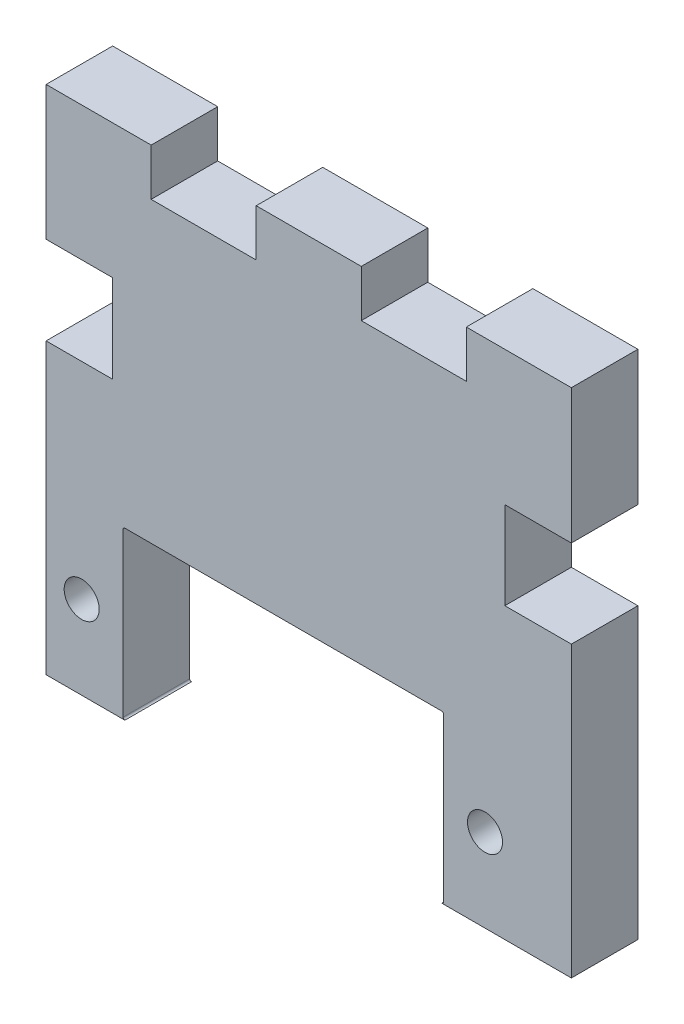
ISO-10303-21;
HEADER;
FILE_DESCRIPTION(('STEP AP214'),'2;1');
FILE_NAME('part.step','',(''),(''),'','','');
FILE_SCHEMA(('AUTOMOTIVE_DESIGN { 1 0 10303 214 1 1 1 1 }'));
ENDSEC;
DATA;
#1=APPLICATION_CONTEXT('core data for automotive mechanical design processes');
#2=APPLICATION_PROTOCOL_DEFINITION('international standard','automotive_design',2000,#1);
#3=PRODUCT_CONTEXT('',#1,'mechanical');
#4=PRODUCT('Part','Part','',(#3));
#5=PRODUCT_RELATED_PRODUCT_CATEGORY('part','',(#4));
#6=PRODUCT_DEFINITION_FORMATION('','',#4);
#7=PRODUCT_DEFINITION_CONTEXT('part definition',#1,'design');
#8=PRODUCT_DEFINITION('design','',#6,#7);
#9=PRODUCT_DEFINITION_SHAPE('','',#8);
#10=(LENGTH_UNIT() NAMED_UNIT(*) SI_UNIT(.MILLI.,.METRE.));
#11=(NAMED_UNIT(*) PLANE_ANGLE_UNIT() SI_UNIT($,.RADIAN.));
#12=(NAMED_UNIT(*) SI_UNIT($,.STERADIAN.) SOLID_ANGLE_UNIT());
#13=UNCERTAINTY_MEASURE_WITH_UNIT(LENGTH_MEASURE(1.E-05),#10,'distance_accuracy_value','');
#14=(GEOMETRIC_REPRESENTATION_CONTEXT(3) GLOBAL_UNCERTAINTY_ASSIGNED_CONTEXT((#13)) GLOBAL_UNIT_ASSIGNED_CONTEXT((#10,
#11,#12)) REPRESENTATION_CONTEXT('',''));
#15=CARTESIAN_POINT('',(0.,0.,0.));
#16=DIRECTION('',(0.,0.,1.));
#17=DIRECTION('',(1.,0.,0.));
#18=AXIS2_PLACEMENT_3D('',#15,#16,#17);
#19=CARTESIAN_POINT('',(38.1,0.,4.826));
#20=DIRECTION('',(-1.,0.,0.));
#21=DIRECTION('',(0.,-1.,0.));
#22=AXIS2_PLACEMENT_3D('',#19,#20,#21);
#23=PLANE('',#22);
#24=DIRECTION('',(0.,1.,0.));
#25=VECTOR('',#24,1.);
#26=CARTESIAN_POINT('',(38.1,0.,4.826));
#27=LINE('',#26,#25);
#28=CARTESIAN_POINT('',(38.1,27.3240988287207,4.826));
#29=VERTEX_POINT('',#28);
#30=CARTESIAN_POINT('',(38.1,37.084,4.826));
#31=VERTEX_POINT('',#30);
#32=EDGE_CURVE('E408',#29,#31,#27,.T.);
#33=ORIENTED_EDGE('',*,*,#32,.F.);
#34=DIRECTION('',(0.,0.,1.));
#35=VECTOR('',#34,1.);
#36=CARTESIAN_POINT('',(38.1,27.3240988287207,0.));
#37=LINE('',#36,#35);
#38=CARTESIAN_POINT('',(38.1,27.3240988287207,0.));
#39=VERTEX_POINT('',#38);
#40=EDGE_CURVE('E250',#39,#29,#37,.T.);
#41=ORIENTED_EDGE('',*,*,#40,.F.);
#42=DIRECTION('',(0.,1.,0.));
#43=VECTOR('',#42,1.);
#44=CARTESIAN_POINT('',(38.1,0.,0.));
#45=LINE('',#44,#43);
#46=CARTESIAN_POINT('',(38.1,37.084,0.));
#47=VERTEX_POINT('',#46);
#48=EDGE_CURVE('E425',#39,#47,#45,.T.);
#49=ORIENTED_EDGE('',*,*,#48,.T.);
#50=DIRECTION('',(0.,0.,-1.));
#51=VECTOR('',#50,1.);
#52=CARTESIAN_POINT('',(38.1,37.084,4.826));
#53=LINE('',#52,#51);
#54=EDGE_CURVE('E435',#31,#47,#53,.T.);
#55=ORIENTED_EDGE('',*,*,#54,.F.);
#56=EDGE_LOOP('',(#33,#41,#49,#55));
#57=FACE_BOUND('',#56,.T.);
#58=ADVANCED_FACE('F33',(#57),#23,.F.);
#59=CARTESIAN_POINT('',(0.,0.,4.826));
#60=DIRECTION('',(1.,0.,0.));
#61=DIRECTION('',(0.,1.,0.));
#62=AXIS2_PLACEMENT_3D('',#59,#60,#61);
#63=PLANE('',#62);
#64=DIRECTION('',(0.,-1.,0.));
#65=VECTOR('',#64,1.);
#66=CARTESIAN_POINT('',(0.,0.,0.));
#67=LINE('',#66,#65);
#68=CARTESIAN_POINT('',(0.,37.084,0.));
#69=VERTEX_POINT('',#68);
#70=CARTESIAN_POINT('',(0.,27.354532370822,0.));
#71=VERTEX_POINT('',#70);
#72=EDGE_CURVE('E418',#69,#71,#67,.T.);
#73=ORIENTED_EDGE('',*,*,#72,.T.);
#74=DIRECTION('',(0.,0.,1.));
#75=VECTOR('',#74,1.);
#76=CARTESIAN_POINT('',(0.,27.354532370822,0.));
#77=LINE('',#76,#75);
#78=CARTESIAN_POINT('',(0.,27.354532370822,4.826));
#79=VERTEX_POINT('',#78);
#80=EDGE_CURVE('E268',#71,#79,#77,.T.);
#81=ORIENTED_EDGE('',*,*,#80,.T.);
#82=DIRECTION('',(0.,-1.,0.));
#83=VECTOR('',#82,1.);
#84=CARTESIAN_POINT('',(0.,0.,4.826));
#85=LINE('',#84,#83);
#86=CARTESIAN_POINT('',(0.,37.084,4.826));
#87=VERTEX_POINT('',#86);
#88=EDGE_CURVE('E400',#87,#79,#85,.T.);
#89=ORIENTED_EDGE('',*,*,#88,.F.);
#90=DIRECTION('',(0.,0.,-1.));
#91=VECTOR('',#90,1.);
#92=CARTESIAN_POINT('',(0.,37.084,4.826));
#93=LINE('',#92,#91);
#94=EDGE_CURVE('E416',#87,#69,#93,.T.);
#95=ORIENTED_EDGE('',*,*,#94,.T.);
#96=EDGE_LOOP('',(#73,#81,#89,#95));
#97=FACE_BOUND('',#96,.T.);
#98=ADVANCED_FACE('F497',(#97),#63,.F.);
#99=CARTESIAN_POINT('',(0.,37.084,4.826));
#100=DIRECTION('',(0.,-1.,0.));
#101=DIRECTION('',(0.,0.,-1.));
#102=AXIS2_PLACEMENT_3D('',#99,#100,#101);
#103=PLANE('',#102);
#104=DIRECTION('',(-1.,0.,0.));
#105=VECTOR('',#104,1.);
#106=CARTESIAN_POINT('',(0.,37.084,4.826));
#107=LINE('',#106,#105);
#108=CARTESIAN_POINT('',(22.86,37.084,4.826));
#109=VERTEX_POINT('',#108);
#110=CARTESIAN_POINT('',(15.24,37.084,4.826));
#111=VERTEX_POINT('',#110);
#112=EDGE_CURVE('E417',#109,#111,#107,.T.);
#113=ORIENTED_EDGE('',*,*,#112,.F.);
#114=DIRECTION('',(0.,0.,1.));
#115=VECTOR('',#114,1.);
#116=CARTESIAN_POINT('',(22.86,37.084,0.));
#117=LINE('',#116,#115);
#118=CARTESIAN_POINT('',(22.86,37.084,0.));
#119=VERTEX_POINT('',#118);
#120=EDGE_CURVE('E294',#119,#109,#117,.T.);
#121=ORIENTED_EDGE('',*,*,#120,.F.);
#122=DIRECTION('',(-1.,0.,0.));
#123=VECTOR('',#122,1.);
#124=CARTESIAN_POINT('',(0.,37.084,0.));
#125=LINE('',#124,#123);
#126=CARTESIAN_POINT('',(15.24,37.084,0.));
#127=VERTEX_POINT('',#126);
#128=EDGE_CURVE('E432',#119,#127,#125,.T.);
#129=ORIENTED_EDGE('',*,*,#128,.T.);
#130=DIRECTION('',(0.,0.,1.));
#131=VECTOR('',#130,1.);
#132=CARTESIAN_POINT('',(15.24,37.084,0.));
#133=LINE('',#132,#131);
#134=EDGE_CURVE('E324',#127,#111,#133,.T.);
#135=ORIENTED_EDGE('',*,*,#134,.T.);
#136=EDGE_LOOP('',(#113,#121,#129,#135));
#137=FACE_BOUND('',#136,.T.);
#138=ADVANCED_FACE('F508',(#137),#103,.F.);
#139=CARTESIAN_POINT('',(7.61999999999999,37.084,4.826));
#140=VERTEX_POINT('',#139);
#141=EDGE_CURVE('E412',#140,#87,#107,.T.);
#142=ORIENTED_EDGE('',*,*,#141,.F.);
#143=DIRECTION('',(0.,0.,1.));
#144=VECTOR('',#143,1.);
#145=CARTESIAN_POINT('',(7.61999999999999,37.084,0.));
#146=LINE('',#145,#144);
#147=CARTESIAN_POINT('',(7.61999999999999,37.084,0.));
#148=VERTEX_POINT('',#147);
#149=EDGE_CURVE('E321',#148,#140,#146,.T.);
#150=ORIENTED_EDGE('',*,*,#149,.F.);
#151=EDGE_CURVE('E428',#148,#69,#125,.T.);
#152=ORIENTED_EDGE('',*,*,#151,.T.);
#153=ORIENTED_EDGE('',*,*,#94,.F.);
#154=EDGE_LOOP('',(#142,#150,#152,#153));
#155=FACE_BOUND('',#154,.T.);
#156=ADVANCED_FACE('F521',(#155),#103,.F.);
#157=CARTESIAN_POINT('',(0.,0.,4.826));
#158=DIRECTION('',(0.,1.,0.));
#159=DIRECTION('',(0.,0.,1.));
#160=AXIS2_PLACEMENT_3D('',#157,#158,#159);
#161=PLANE('',#160);
#162=DIRECTION('',(0.,0.,-1.));
#163=VECTOR('',#162,1.);
#164=CARTESIAN_POINT('',(5.71500000000001,0.,4.826));
#165=LINE('',#164,#163);
#166=CARTESIAN_POINT('',(5.71500000000001,0.,4.826));
#167=VERTEX_POINT('',#166);
#168=CARTESIAN_POINT('',(5.71500000000001,0.,0.));
#169=VERTEX_POINT('',#168);
#170=EDGE_CURVE('E379',#167,#169,#165,.T.);
#171=ORIENTED_EDGE('',*,*,#170,.F.);
#172=DIRECTION('',(1.,0.,0.));
#173=VECTOR('',#172,1.);
#174=CARTESIAN_POINT('',(0.,0.,4.826));
#175=LINE('',#174,#173);
#176=CARTESIAN_POINT('',(0.,0.,4.826));
#177=VERTEX_POINT('',#176);
#178=EDGE_CURVE('E405',#177,#167,#175,.T.);
#179=ORIENTED_EDGE('',*,*,#178,.F.);
#180=DIRECTION('',(0.,0.,-1.));
#181=VECTOR('',#180,1.);
#182=CARTESIAN_POINT('',(0.,0.,4.826));
#183=LINE('',#182,#181);
#184=CARTESIAN_POINT('',(0.,0.,0.));
#185=VERTEX_POINT('',#184);
#186=EDGE_CURVE('E11',#177,#185,#183,.T.);
#187=ORIENTED_EDGE('',*,*,#186,.T.);
#188=DIRECTION('',(1.,0.,0.));
#189=VECTOR('',#188,1.);
#190=CARTESIAN_POINT('',(0.,0.,0.));
#191=LINE('',#190,#189);
#192=EDGE_CURVE('E422',#185,#169,#191,.T.);
#193=ORIENTED_EDGE('',*,*,#192,.T.);
#194=EDGE_LOOP('',(#171,#179,#187,#193));
#195=FACE_BOUND('',#194,.T.);
#196=ADVANCED_FACE('F480',(#195),#161,.F.);
#197=CARTESIAN_POINT('',(0.,20.9740988287207,4.826));
#198=VERTEX_POINT('',#197);
#199=EDGE_CURVE('E404',#198,#177,#85,.T.);
#200=ORIENTED_EDGE('',*,*,#199,.F.);
#201=DIRECTION('',(0.,0.,1.));
#202=VECTOR('',#201,1.);
#203=CARTESIAN_POINT('',(0.,20.9740988287207,0.));
#204=LINE('',#203,#202);
#205=CARTESIAN_POINT('',(0.,20.9740988287207,0.));
#206=VERTEX_POINT('',#205);
#207=EDGE_CURVE('E261',#206,#198,#204,.T.);
#208=ORIENTED_EDGE('',*,*,#207,.F.);
#209=EDGE_CURVE('E397',#206,#185,#67,.T.);
#210=ORIENTED_EDGE('',*,*,#209,.T.);
#211=ORIENTED_EDGE('',*,*,#186,.F.);
#212=EDGE_LOOP('',(#200,#208,#210,#211));
#213=FACE_BOUND('',#212,.T.);
#214=ADVANCED_FACE('F35',(#213),#63,.F.);
#215=CARTESIAN_POINT('',(28.702,0.,4.826));
#216=VERTEX_POINT('',#215);
#217=CARTESIAN_POINT('',(38.1,0.,4.826));
#218=VERTEX_POINT('',#217);
#219=EDGE_CURVE('E403',#216,#218,#175,.T.);
#220=ORIENTED_EDGE('',*,*,#219,.F.);
#221=DIRECTION('',(0.,0.,-1.));
#222=VECTOR('',#221,1.);
#223=CARTESIAN_POINT('',(28.702,0.,4.826));
#224=LINE('',#223,#222);
#225=CARTESIAN_POINT('',(28.702,0.,0.));
#226=VERTEX_POINT('',#225);
#227=EDGE_CURVE('E381',#216,#226,#224,.T.);
#228=ORIENTED_EDGE('',*,*,#227,.T.);
#229=CARTESIAN_POINT('',(38.1,0.,0.));
#230=VERTEX_POINT('',#229);
#231=EDGE_CURVE('E421',#226,#230,#191,.T.);
#232=ORIENTED_EDGE('',*,*,#231,.T.);
#233=DIRECTION('',(0.,0.,-1.));
#234=VECTOR('',#233,1.);
#235=CARTESIAN_POINT('',(38.1,0.,4.826));
#236=LINE('',#235,#234);
#237=EDGE_CURVE('E41',#218,#230,#236,.T.);
#238=ORIENTED_EDGE('',*,*,#237,.F.);
#239=EDGE_LOOP('',(#220,#228,#232,#238));
#240=FACE_BOUND('',#239,.T.);
#241=ADVANCED_FACE('F447',(#240),#161,.F.);
#242=CARTESIAN_POINT('',(38.1,20.9740988287207,0.));
#243=VERTEX_POINT('',#242);
#244=EDGE_CURVE('E426',#230,#243,#45,.T.);
#245=ORIENTED_EDGE('',*,*,#244,.T.);
#246=DIRECTION('',(0.,0.,1.));
#247=VECTOR('',#246,1.);
#248=CARTESIAN_POINT('',(38.1,20.9740988287207,0.));
#249=LINE('',#248,#247);
#250=CARTESIAN_POINT('',(38.1,20.9740988287207,4.826));
#251=VERTEX_POINT('',#250);
#252=EDGE_CURVE('E48',#243,#251,#249,.T.);
#253=ORIENTED_EDGE('',*,*,#252,.T.);
#254=EDGE_CURVE('E409',#218,#251,#27,.T.);
#255=ORIENTED_EDGE('',*,*,#254,.F.);
#256=ORIENTED_EDGE('',*,*,#237,.T.);
#257=EDGE_LOOP('',(#245,#253,#255,#256));
#258=FACE_BOUND('',#257,.T.);
#259=ADVANCED_FACE('F441',(#258),#23,.F.);
#260=CARTESIAN_POINT('',(30.48,37.084,0.));
#261=VERTEX_POINT('',#260);
#262=EDGE_CURVE('E429',#47,#261,#125,.T.);
#263=ORIENTED_EDGE('',*,*,#262,.T.);
#264=DIRECTION('',(0.,0.,1.));
#265=VECTOR('',#264,1.);
#266=CARTESIAN_POINT('',(30.48,37.084,0.));
#267=LINE('',#266,#265);
#268=CARTESIAN_POINT('',(30.48,37.084,4.826));
#269=VERTEX_POINT('',#268);
#270=EDGE_CURVE('E297',#261,#269,#267,.T.);
#271=ORIENTED_EDGE('',*,*,#270,.T.);
#272=EDGE_CURVE('E413',#31,#269,#107,.T.);
#273=ORIENTED_EDGE('',*,*,#272,.F.);
#274=ORIENTED_EDGE('',*,*,#54,.T.);
#275=EDGE_LOOP('',(#263,#271,#273,#274));
#276=FACE_BOUND('',#275,.T.);
#277=ADVANCED_FACE('F524',(#276),#103,.F.);
#278=CARTESIAN_POINT('',(0.,0.,4.826));
#279=DIRECTION('',(0.,0.,-1.));
#280=DIRECTION('',(-1.,0.,0.));
#281=AXIS2_PLACEMENT_3D('',#278,#279,#280);
#282=PLANE('',#281);
#283=DIRECTION('',(0.,-1.,0.));
#284=VECTOR('',#283,1.);
#285=CARTESIAN_POINT('',(33.274,27.3240988287207,4.826));
#286=LINE('',#285,#284);
#287=CARTESIAN_POINT('',(33.274,27.3240988287207,4.826));
#288=VERTEX_POINT('',#287);
#289=CARTESIAN_POINT('',(33.274,20.9740988287207,4.826));
#290=VERTEX_POINT('',#289);
#291=EDGE_CURVE('E225',#288,#290,#286,.T.);
#292=ORIENTED_EDGE('',*,*,#291,.F.);
#293=DIRECTION('',(-1.,0.,0.));
#294=VECTOR('',#293,1.);
#295=CARTESIAN_POINT('',(33.274,27.3240988287207,4.826));
#296=LINE('',#295,#294);
#297=EDGE_CURVE('E238',#29,#288,#296,.T.);
#298=ORIENTED_EDGE('',*,*,#297,.F.);
#299=ORIENTED_EDGE('',*,*,#32,.T.);
#300=ORIENTED_EDGE('',*,*,#272,.T.);
#301=DIRECTION('',(0.,1.,0.));
#302=VECTOR('',#301,1.);
#303=CARTESIAN_POINT('',(30.48,37.084,4.826));
#304=LINE('',#303,#302);
#305=CARTESIAN_POINT('',(30.48,33.6740988287207,4.826));
#306=VERTEX_POINT('',#305);
#307=EDGE_CURVE('E281',#306,#269,#304,.T.);
#308=ORIENTED_EDGE('',*,*,#307,.F.);
#309=DIRECTION('',(1.,0.,0.));
#310=VECTOR('',#309,1.);
#311=CARTESIAN_POINT('',(22.86,33.6740988287207,4.826));
#312=LINE('',#311,#310);
#313=CARTESIAN_POINT('',(22.86,33.6740988287207,4.826));
#314=VERTEX_POINT('',#313);
#315=EDGE_CURVE('E290',#314,#306,#312,.T.);
#316=ORIENTED_EDGE('',*,*,#315,.F.);
#317=DIRECTION('',(0.,-1.,0.));
#318=VECTOR('',#317,1.);
#319=CARTESIAN_POINT('',(22.86,37.084,4.826));
#320=LINE('',#319,#318);
#321=EDGE_CURVE('E271',#109,#314,#320,.T.);
#322=ORIENTED_EDGE('',*,*,#321,.F.);
#323=ORIENTED_EDGE('',*,*,#112,.T.);
#324=DIRECTION('',(0.,1.,0.));
#325=VECTOR('',#324,1.);
#326=CARTESIAN_POINT('',(15.24,37.084,4.826));
#327=LINE('',#326,#325);
#328=CARTESIAN_POINT('',(15.24,33.6740988287207,4.826));
#329=VERTEX_POINT('',#328);
#330=EDGE_CURVE('E307',#329,#111,#327,.T.);
#331=ORIENTED_EDGE('',*,*,#330,.F.);
#332=DIRECTION('',(1.,0.,0.));
#333=VECTOR('',#332,1.);
#334=CARTESIAN_POINT('',(7.61999999999999,33.6740988287207,4.826));
#335=LINE('',#334,#333);
#336=CARTESIAN_POINT('',(7.61999999999999,33.6740988287207,4.826));
#337=VERTEX_POINT('',#336);
#338=EDGE_CURVE('E316',#337,#329,#335,.T.);
#339=ORIENTED_EDGE('',*,*,#338,.F.);
#340=DIRECTION('',(0.,-1.,0.));
#341=VECTOR('',#340,1.);
#342=CARTESIAN_POINT('',(7.61999999999999,37.084,4.826));
#343=LINE('',#342,#341);
#344=EDGE_CURVE('E296',#140,#337,#343,.T.);
#345=ORIENTED_EDGE('',*,*,#344,.F.);
#346=ORIENTED_EDGE('',*,*,#141,.T.);
#347=ORIENTED_EDGE('',*,*,#88,.T.);
#348=DIRECTION('',(-1.,0.,0.));
#349=VECTOR('',#348,1.);
#350=CARTESIAN_POINT('',(0.,27.354532370822,4.826));
#351=LINE('',#350,#349);
#352=CARTESIAN_POINT('',(4.826,27.354532370822,4.826));
#353=VERTEX_POINT('',#352);
#354=EDGE_CURVE('E256',#353,#79,#351,.T.);
#355=ORIENTED_EDGE('',*,*,#354,.F.);
#356=DIRECTION('',(0.,1.,0.));
#357=VECTOR('',#356,1.);
#358=CARTESIAN_POINT('',(4.826,27.354532370822,4.826));
#359=LINE('',#358,#357);
#360=CARTESIAN_POINT('',(4.826,20.9740988287207,4.826));
#361=VERTEX_POINT('',#360);
#362=EDGE_CURVE('E264',#361,#353,#359,.T.);
#363=ORIENTED_EDGE('',*,*,#362,.F.);
#364=DIRECTION('',(1.,0.,0.));
#365=VECTOR('',#364,1.);
#366=CARTESIAN_POINT('',(0.,20.9740988287207,4.826));
#367=LINE('',#366,#365);
#368=EDGE_CURVE('E249',#198,#361,#367,.T.);
#369=ORIENTED_EDGE('',*,*,#368,.F.);
#370=ORIENTED_EDGE('',*,*,#199,.T.);
#371=ORIENTED_EDGE('',*,*,#178,.T.);
#372=CARTESIAN_POINT('',(5.71500000000001,0.126999999999999,4.826));
#373=DIRECTION('',(0.,0.,-1.));
#374=DIRECTION('',(-1.,0.,0.));
#375=AXIS2_PLACEMENT_3D('',#372,#373,#374);
#376=CIRCLE('',#375,0.127);
#377=CARTESIAN_POINT('',(5.58800000000001,0.126999999999999,4.826));
#378=VERTEX_POINT('',#377);
#379=EDGE_CURVE('E340',#167,#378,#376,.T.);
#380=ORIENTED_EDGE('',*,*,#379,.T.);
#381=DIRECTION('',(0.,1.,0.));
#382=VECTOR('',#381,1.);
#383=CARTESIAN_POINT('',(5.58800000000001,11.938,4.826));
#384=LINE('',#383,#382);
#385=CARTESIAN_POINT('',(5.58800000000001,11.938,4.826));
#386=VERTEX_POINT('',#385);
#387=EDGE_CURVE('E343',#378,#386,#384,.T.);
#388=ORIENTED_EDGE('',*,*,#387,.T.);
#389=CARTESIAN_POINT('',(5.71500000000001,11.938,4.826));
#390=DIRECTION('',(0.,0.,-1.));
#391=DIRECTION('',(-1.,0.,0.));
#392=AXIS2_PLACEMENT_3D('',#389,#390,#391);
#393=CIRCLE('',#392,0.127);
#394=CARTESIAN_POINT('',(5.71500000000001,12.065,4.826));
#395=VERTEX_POINT('',#394);
#396=EDGE_CURVE('E346',#386,#395,#393,.T.);
#397=ORIENTED_EDGE('',*,*,#396,.T.);
#398=DIRECTION('',(1.,0.,0.));
#399=VECTOR('',#398,1.);
#400=CARTESIAN_POINT('',(28.702,12.065,4.826));
#401=LINE('',#400,#399);
#402=CARTESIAN_POINT('',(28.702,12.065,4.826));
#403=VERTEX_POINT('',#402);
#404=EDGE_CURVE('E349',#395,#403,#401,.T.);
#405=ORIENTED_EDGE('',*,*,#404,.T.);
#406=CARTESIAN_POINT('',(28.702,11.938,4.826));
#407=DIRECTION('',(0.,0.,-1.));
#408=DIRECTION('',(-1.,0.,0.));
#409=AXIS2_PLACEMENT_3D('',#406,#407,#408);
#410=CIRCLE('',#409,0.127);
#411=CARTESIAN_POINT('',(28.829,11.938,4.826));
#412=VERTEX_POINT('',#411);
#413=EDGE_CURVE('E330',#403,#412,#410,.T.);
#414=ORIENTED_EDGE('',*,*,#413,.T.);
#415=DIRECTION('',(0.,-1.,0.));
#416=VECTOR('',#415,1.);
#417=CARTESIAN_POINT('',(28.829,0.126999999999995,4.826));
#418=LINE('',#417,#416);
#419=CARTESIAN_POINT('',(28.829,0.126999999999995,4.826));
#420=VERTEX_POINT('',#419);
#421=EDGE_CURVE('E333',#412,#420,#418,.T.);
#422=ORIENTED_EDGE('',*,*,#421,.T.);
#423=CARTESIAN_POINT('',(28.702,0.126999999999995,4.826));
#424=DIRECTION('',(0.,0.,-1.));
#425=DIRECTION('',(-1.,0.,0.));
#426=AXIS2_PLACEMENT_3D('',#423,#424,#425);
#427=CIRCLE('',#426,0.127);
#428=EDGE_CURVE('E337',#420,#216,#427,.T.);
#429=ORIENTED_EDGE('',*,*,#428,.T.);
#430=ORIENTED_EDGE('',*,*,#219,.T.);
#431=ORIENTED_EDGE('',*,*,#254,.T.);
#432=DIRECTION('',(1.,0.,0.));
#433=VECTOR('',#432,1.);
#434=CARTESIAN_POINT('',(33.274,20.9740988287207,4.826));
#435=LINE('',#434,#433);
#436=EDGE_CURVE('E241',#290,#251,#435,.T.);
#437=ORIENTED_EDGE('',*,*,#436,.F.);
#438=EDGE_LOOP('',(#292,#298,#299,#300,#308,#316,#322,#323,#331,#339,#345,#346,#347,#355,#363,
#369,#370,#371,#380,#388,#397,#405,#414,#422,#429,#430,#431,#437));
#439=FACE_BOUND('',#438,.T.);
#440=CARTESIAN_POINT('',(31.8365194618769,6.03249999999999,4.826));
#441=DIRECTION('',(0.,0.,1.));
#442=DIRECTION('',(1.,0.,0.));
#443=AXIS2_PLACEMENT_3D('',#440,#441,#442);
#444=CIRCLE('',#443,1.27);
#445=CARTESIAN_POINT('',(33.1065194618769,6.03249999999999,4.826));
#446=VERTEX_POINT('',#445);
#447=EDGE_CURVE('E372',#446,#446,#444,.T.);
#448=ORIENTED_EDGE('',*,*,#447,.F.);
#449=EDGE_LOOP('',(#448));
#450=FACE_BOUND('',#449,.T.);
#451=CARTESIAN_POINT('',(2.58048053812314,6.0325,4.826));
#452=DIRECTION('',(0.,0.,1.));
#453=DIRECTION('',(1.,0.,0.));
#454=AXIS2_PLACEMENT_3D('',#451,#452,#453);
#455=CIRCLE('',#454,1.27);
#456=CARTESIAN_POINT('',(3.85048053812314,6.0325,4.826));
#457=VERTEX_POINT('',#456);
#458=EDGE_CURVE('E391',#457,#457,#455,.T.);
#459=ORIENTED_EDGE('',*,*,#458,.F.);
#460=EDGE_LOOP('',(#459));
#461=FACE_BOUND('',#460,.T.);
#462=ADVANCED_FACE('F452',(#439,#450,#461),#282,.F.);
#463=CARTESIAN_POINT('',(0.,0.,0.));
#464=DIRECTION('',(0.,0.,-1.));
#465=DIRECTION('',(-1.,0.,0.));
#466=AXIS2_PLACEMENT_3D('',#463,#464,#465);
#467=PLANE('',#466);
#468=DIRECTION('',(-1.,0.,0.));
#469=VECTOR('',#468,1.);
#470=CARTESIAN_POINT('',(33.274,27.3240988287207,0.));
#471=LINE('',#470,#469);
#472=CARTESIAN_POINT('',(33.274,27.3240988287207,0.));
#473=VERTEX_POINT('',#472);
#474=EDGE_CURVE('E227',#39,#473,#471,.T.);
#475=ORIENTED_EDGE('',*,*,#474,.T.);
#476=DIRECTION('',(0.,-1.,0.));
#477=VECTOR('',#476,1.);
#478=CARTESIAN_POINT('',(33.274,27.3240988287207,0.));
#479=LINE('',#478,#477);
#480=CARTESIAN_POINT('',(33.274,20.9740988287207,0.));
#481=VERTEX_POINT('',#480);
#482=EDGE_CURVE('E222',#473,#481,#479,.T.);
#483=ORIENTED_EDGE('',*,*,#482,.T.);
#484=DIRECTION('',(1.,0.,0.));
#485=VECTOR('',#484,1.);
#486=CARTESIAN_POINT('',(33.274,20.9740988287207,0.));
#487=LINE('',#486,#485);
#488=EDGE_CURVE('E229',#481,#243,#487,.T.);
#489=ORIENTED_EDGE('',*,*,#488,.T.);
#490=ORIENTED_EDGE('',*,*,#244,.F.);
#491=ORIENTED_EDGE('',*,*,#231,.F.);
#492=CARTESIAN_POINT('',(28.702,0.126999999999995,0.));
#493=DIRECTION('',(0.,0.,-1.));
#494=DIRECTION('',(-1.,0.,0.));
#495=AXIS2_PLACEMENT_3D('',#492,#493,#494);
#496=CIRCLE('',#495,0.127);
#497=CARTESIAN_POINT('',(28.829,0.126999999999995,0.));
#498=VERTEX_POINT('',#497);
#499=EDGE_CURVE('E357',#498,#226,#496,.T.);
#500=ORIENTED_EDGE('',*,*,#499,.F.);
#501=DIRECTION('',(0.,-1.,0.));
#502=VECTOR('',#501,1.);
#503=CARTESIAN_POINT('',(28.829,0.126999999999995,0.));
#504=LINE('',#503,#502);
#505=CARTESIAN_POINT('',(28.829,11.938,0.));
#506=VERTEX_POINT('',#505);
#507=EDGE_CURVE('E354',#506,#498,#504,.T.);
#508=ORIENTED_EDGE('',*,*,#507,.F.);
#509=CARTESIAN_POINT('',(28.702,11.938,0.));
#510=DIRECTION('',(0.,0.,-1.));
#511=DIRECTION('',(-1.,0.,0.));
#512=AXIS2_PLACEMENT_3D('',#509,#510,#511);
#513=CIRCLE('',#512,0.127);
#514=CARTESIAN_POINT('',(28.702,12.065,0.));
#515=VERTEX_POINT('',#514);
#516=EDGE_CURVE('E323',#515,#506,#513,.T.);
#517=ORIENTED_EDGE('',*,*,#516,.F.);
#518=DIRECTION('',(1.,0.,0.));
#519=VECTOR('',#518,1.);
#520=CARTESIAN_POINT('',(28.702,12.065,0.));
#521=LINE('',#520,#519);
#522=CARTESIAN_POINT('',(5.71500000000001,12.065,0.));
#523=VERTEX_POINT('',#522);
#524=EDGE_CURVE('E334',#523,#515,#521,.T.);
#525=ORIENTED_EDGE('',*,*,#524,.F.);
#526=CARTESIAN_POINT('',(5.71500000000001,11.938,0.));
#527=DIRECTION('',(0.,0.,-1.));
#528=DIRECTION('',(-1.,0.,0.));
#529=AXIS2_PLACEMENT_3D('',#526,#527,#528);
#530=CIRCLE('',#529,0.127);
#531=CARTESIAN_POINT('',(5.58800000000001,11.938,0.));
#532=VERTEX_POINT('',#531);
#533=EDGE_CURVE('E365',#532,#523,#530,.T.);
#534=ORIENTED_EDGE('',*,*,#533,.F.);
#535=DIRECTION('',(0.,1.,0.));
#536=VECTOR('',#535,1.);
#537=CARTESIAN_POINT('',(5.58800000000001,11.938,0.));
#538=LINE('',#537,#536);
#539=CARTESIAN_POINT('',(5.58800000000001,0.126999999999999,0.));
#540=VERTEX_POINT('',#539);
#541=EDGE_CURVE('E362',#540,#532,#538,.T.);
#542=ORIENTED_EDGE('',*,*,#541,.F.);
#543=CARTESIAN_POINT('',(5.71500000000001,0.126999999999999,0.));
#544=DIRECTION('',(0.,0.,-1.));
#545=DIRECTION('',(-1.,0.,0.));
#546=AXIS2_PLACEMENT_3D('',#543,#544,#545);
#547=CIRCLE('',#546,0.127);
#548=EDGE_CURVE('E359',#169,#540,#547,.T.);
#549=ORIENTED_EDGE('',*,*,#548,.F.);
#550=ORIENTED_EDGE('',*,*,#192,.F.);
#551=ORIENTED_EDGE('',*,*,#209,.F.);
#552=DIRECTION('',(1.,0.,0.));
#553=VECTOR('',#552,1.);
#554=CARTESIAN_POINT('',(0.,20.9740988287207,0.));
#555=LINE('',#554,#553);
#556=CARTESIAN_POINT('',(4.826,20.9740988287207,0.));
#557=VERTEX_POINT('',#556);
#558=EDGE_CURVE('E253',#206,#557,#555,.T.);
#559=ORIENTED_EDGE('',*,*,#558,.T.);
#560=DIRECTION('',(0.,1.,0.));
#561=VECTOR('',#560,1.);
#562=CARTESIAN_POINT('',(4.826,27.354532370822,0.));
#563=LINE('',#562,#561);
#564=CARTESIAN_POINT('',(4.826,27.354532370822,0.));
#565=VERTEX_POINT('',#564);
#566=EDGE_CURVE('E56',#557,#565,#563,.T.);
#567=ORIENTED_EDGE('',*,*,#566,.T.);
#568=DIRECTION('',(-1.,0.,0.));
#569=VECTOR('',#568,1.);
#570=CARTESIAN_POINT('',(0.,27.354532370822,0.));
#571=LINE('',#570,#569);
#572=EDGE_CURVE('E258',#565,#71,#571,.T.);
#573=ORIENTED_EDGE('',*,*,#572,.T.);
#574=ORIENTED_EDGE('',*,*,#72,.F.);
#575=ORIENTED_EDGE('',*,*,#151,.F.);
#576=DIRECTION('',(0.,-1.,0.));
#577=VECTOR('',#576,1.);
#578=CARTESIAN_POINT('',(7.61999999999999,37.084,0.));
#579=LINE('',#578,#577);
#580=CARTESIAN_POINT('',(7.61999999999999,33.6740988287207,0.));
#581=VERTEX_POINT('',#580);
#582=EDGE_CURVE('E303',#148,#581,#579,.T.);
#583=ORIENTED_EDGE('',*,*,#582,.T.);
#584=DIRECTION('',(1.,0.,0.));
#585=VECTOR('',#584,1.);
#586=CARTESIAN_POINT('',(7.61999999999999,33.6740988287207,0.));
#587=LINE('',#586,#585);
#588=CARTESIAN_POINT('',(15.24,33.6740988287207,0.));
#589=VERTEX_POINT('',#588);
#590=EDGE_CURVE('E306',#581,#589,#587,.T.);
#591=ORIENTED_EDGE('',*,*,#590,.T.);
#592=DIRECTION('',(0.,1.,0.));
#593=VECTOR('',#592,1.);
#594=CARTESIAN_POINT('',(15.24,37.084,0.));
#595=LINE('',#594,#593);
#596=EDGE_CURVE('E310',#589,#127,#595,.T.);
#597=ORIENTED_EDGE('',*,*,#596,.T.);
#598=ORIENTED_EDGE('',*,*,#128,.F.);
#599=DIRECTION('',(0.,-1.,0.));
#600=VECTOR('',#599,1.);
#601=CARTESIAN_POINT('',(22.86,37.084,0.));
#602=LINE('',#601,#600);
#603=CARTESIAN_POINT('',(22.86,33.6740988287207,0.));
#604=VERTEX_POINT('',#603);
#605=EDGE_CURVE('E277',#119,#604,#602,.T.);
#606=ORIENTED_EDGE('',*,*,#605,.T.);
#607=DIRECTION('',(1.,0.,0.));
#608=VECTOR('',#607,1.);
#609=CARTESIAN_POINT('',(22.86,33.6740988287207,0.));
#610=LINE('',#609,#608);
#611=CARTESIAN_POINT('',(30.48,33.6740988287207,0.));
#612=VERTEX_POINT('',#611);
#613=EDGE_CURVE('E280',#604,#612,#610,.T.);
#614=ORIENTED_EDGE('',*,*,#613,.T.);
#615=DIRECTION('',(0.,1.,0.));
#616=VECTOR('',#615,1.);
#617=CARTESIAN_POINT('',(30.48,37.084,0.));
#618=LINE('',#617,#616);
#619=EDGE_CURVE('E284',#612,#261,#618,.T.);
#620=ORIENTED_EDGE('',*,*,#619,.T.);
#621=ORIENTED_EDGE('',*,*,#262,.F.);
#622=ORIENTED_EDGE('',*,*,#48,.F.);
#623=EDGE_LOOP('',(#475,#483,#489,#490,#491,#500,#508,#517,#525,#534,#542,#549,#550,#551,#559,
#567,#573,#574,#575,#583,#591,#597,#598,#606,#614,#620,#621,#622));
#624=FACE_BOUND('',#623,.T.);
#625=CARTESIAN_POINT('',(31.8365194618769,6.03249999999999,0.));
#626=DIRECTION('',(0.,0.,1.));
#627=DIRECTION('',(1.,0.,0.));
#628=AXIS2_PLACEMENT_3D('',#625,#626,#627);
#629=CIRCLE('',#628,1.27);
#630=CARTESIAN_POINT('',(33.1065194618769,6.03249999999999,0.));
#631=VERTEX_POINT('',#630);
#632=EDGE_CURVE('E388',#631,#631,#629,.T.);
#633=ORIENTED_EDGE('',*,*,#632,.T.);
#634=EDGE_LOOP('',(#633));
#635=FACE_BOUND('',#634,.T.);
#636=CARTESIAN_POINT('',(2.58048053812314,6.0325,0.));
#637=DIRECTION('',(0.,0.,1.));
#638=DIRECTION('',(1.,0.,0.));
#639=AXIS2_PLACEMENT_3D('',#636,#637,#638);
#640=CIRCLE('',#639,1.27);
#641=CARTESIAN_POINT('',(3.85048053812314,6.0325,0.));
#642=VERTEX_POINT('',#641);
#643=EDGE_CURVE('E394',#642,#642,#640,.T.);
#644=ORIENTED_EDGE('',*,*,#643,.T.);
#645=EDGE_LOOP('',(#644));
#646=FACE_BOUND('',#645,.T.);
#647=ADVANCED_FACE('F235',(#624,#635,#646),#467,.T.);
#648=CARTESIAN_POINT('',(2.58048053812314,6.0325,0.));
#649=DIRECTION('',(0.,0.,1.));
#650=DIRECTION('',(1.,0.,0.));
#651=AXIS2_PLACEMENT_3D('',#648,#649,#650);
#652=CYLINDRICAL_SURFACE('',#651,1.27);
#653=ORIENTED_EDGE('',*,*,#643,.F.);
#654=EDGE_LOOP('',(#653));
#655=FACE_BOUND('',#654,.T.);
#656=ORIENTED_EDGE('',*,*,#458,.T.);
#657=EDGE_LOOP('',(#656));
#658=FACE_BOUND('',#657,.T.);
#659=ADVANCED_FACE('F655',(#655,#658),#652,.F.);
#660=CARTESIAN_POINT('',(31.8365194618769,6.03249999999999,0.));
#661=DIRECTION('',(0.,0.,1.));
#662=DIRECTION('',(1.,0.,0.));
#663=AXIS2_PLACEMENT_3D('',#660,#661,#662);
#664=CYLINDRICAL_SURFACE('',#663,1.27);
#665=ORIENTED_EDGE('',*,*,#632,.F.);
#666=EDGE_LOOP('',(#665));
#667=FACE_BOUND('',#666,.T.);
#668=ORIENTED_EDGE('',*,*,#447,.T.);
#669=EDGE_LOOP('',(#668));
#670=FACE_BOUND('',#669,.T.);
#671=ADVANCED_FACE('F652',(#667,#670),#664,.F.);
#672=CARTESIAN_POINT('',(28.702,11.938,4.826));
#673=DIRECTION('',(0.,0.,-1.));
#674=DIRECTION('',(-1.,0.,0.));
#675=AXIS2_PLACEMENT_3D('',#672,#673,#674);
#676=CYLINDRICAL_SURFACE('',#675,0.127);
#677=ORIENTED_EDGE('',*,*,#516,.T.);
#678=DIRECTION('',(0.,0.,-1.));
#679=VECTOR('',#678,1.);
#680=CARTESIAN_POINT('',(28.829,11.938,4.826));
#681=LINE('',#680,#679);
#682=EDGE_CURVE('E352',#412,#506,#681,.T.);
#683=ORIENTED_EDGE('',*,*,#682,.F.);
#684=ORIENTED_EDGE('',*,*,#413,.F.);
#685=DIRECTION('',(0.,0.,-1.));
#686=VECTOR('',#685,1.);
#687=CARTESIAN_POINT('',(28.702,12.065,4.826));
#688=LINE('',#687,#686);
#689=EDGE_CURVE('E370',#403,#515,#688,.T.);
#690=ORIENTED_EDGE('',*,*,#689,.T.);
#691=EDGE_LOOP('',(#677,#683,#684,#690));
#692=FACE_BOUND('',#691,.T.);
#693=ADVANCED_FACE('F462',(#692),#676,.F.);
#694=CARTESIAN_POINT('',(28.702,12.065,4.826));
#695=DIRECTION('',(0.,1.,0.));
#696=DIRECTION('',(-1.,0.,0.));
#697=AXIS2_PLACEMENT_3D('',#694,#695,#696);
#698=PLANE('',#697);
#699=ORIENTED_EDGE('',*,*,#524,.T.);
#700=ORIENTED_EDGE('',*,*,#689,.F.);
#701=ORIENTED_EDGE('',*,*,#404,.F.);
#702=DIRECTION('',(0.,0.,-1.));
#703=VECTOR('',#702,1.);
#704=CARTESIAN_POINT('',(5.71500000000001,12.065,4.826));
#705=LINE('',#704,#703);
#706=EDGE_CURVE('E373',#395,#523,#705,.T.);
#707=ORIENTED_EDGE('',*,*,#706,.T.);
#708=EDGE_LOOP('',(#699,#700,#701,#707));
#709=FACE_BOUND('',#708,.T.);
#710=ADVANCED_FACE('F465',(#709),#698,.F.);
#711=CARTESIAN_POINT('',(5.71500000000001,11.938,4.826));
#712=DIRECTION('',(0.,0.,-1.));
#713=DIRECTION('',(-1.,0.,0.));
#714=AXIS2_PLACEMENT_3D('',#711,#712,#713);
#715=CYLINDRICAL_SURFACE('',#714,0.127);
#716=ORIENTED_EDGE('',*,*,#533,.T.);
#717=ORIENTED_EDGE('',*,*,#706,.F.);
#718=ORIENTED_EDGE('',*,*,#396,.F.);
#719=DIRECTION('',(0.,0.,-1.));
#720=VECTOR('',#719,1.);
#721=CARTESIAN_POINT('',(5.58800000000001,11.938,4.826));
#722=LINE('',#721,#720);
#723=EDGE_CURVE('E375',#386,#532,#722,.T.);
#724=ORIENTED_EDGE('',*,*,#723,.T.);
#725=EDGE_LOOP('',(#716,#717,#718,#724));
#726=FACE_BOUND('',#725,.T.);
#727=ADVANCED_FACE('F468',(#726),#715,.F.);
#728=CARTESIAN_POINT('',(5.58800000000001,11.938,4.826));
#729=DIRECTION('',(-1.,0.,0.));
#730=DIRECTION('',(0.,0.,1.));
#731=AXIS2_PLACEMENT_3D('',#728,#729,#730);
#732=PLANE('',#731);
#733=ORIENTED_EDGE('',*,*,#541,.T.);
#734=ORIENTED_EDGE('',*,*,#723,.F.);
#735=ORIENTED_EDGE('',*,*,#387,.F.);
#736=DIRECTION('',(0.,0.,-1.));
#737=VECTOR('',#736,1.);
#738=CARTESIAN_POINT('',(5.58800000000001,0.126999999999999,4.826));
#739=LINE('',#738,#737);
#740=EDGE_CURVE('E377',#378,#540,#739,.T.);
#741=ORIENTED_EDGE('',*,*,#740,.T.);
#742=EDGE_LOOP('',(#733,#734,#735,#741));
#743=FACE_BOUND('',#742,.T.);
#744=ADVANCED_FACE('F473',(#743),#732,.F.);
#745=CARTESIAN_POINT('',(5.71500000000001,0.126999999999999,4.826));
#746=DIRECTION('',(0.,0.,-1.));
#747=DIRECTION('',(-1.,0.,0.));
#748=AXIS2_PLACEMENT_3D('',#745,#746,#747);
#749=CYLINDRICAL_SURFACE('',#748,0.127);
#750=ORIENTED_EDGE('',*,*,#548,.T.);
#751=ORIENTED_EDGE('',*,*,#740,.F.);
#752=ORIENTED_EDGE('',*,*,#379,.F.);
#753=ORIENTED_EDGE('',*,*,#170,.T.);
#754=EDGE_LOOP('',(#750,#751,#752,#753));
#755=FACE_BOUND('',#754,.T.);
#756=ADVANCED_FACE('F476',(#755),#749,.F.);
#757=CARTESIAN_POINT('',(28.702,0.126999999999995,4.826));
#758=DIRECTION('',(0.,0.,-1.));
#759=DIRECTION('',(-1.,0.,0.));
#760=AXIS2_PLACEMENT_3D('',#757,#758,#759);
#761=CYLINDRICAL_SURFACE('',#760,0.127);
#762=ORIENTED_EDGE('',*,*,#499,.T.);
#763=ORIENTED_EDGE('',*,*,#227,.F.);
#764=ORIENTED_EDGE('',*,*,#428,.F.);
#765=DIRECTION('',(0.,0.,-1.));
#766=VECTOR('',#765,1.);
#767=CARTESIAN_POINT('',(28.829,0.126999999999995,4.826));
#768=LINE('',#767,#766);
#769=EDGE_CURVE('E384',#420,#498,#768,.T.);
#770=ORIENTED_EDGE('',*,*,#769,.T.);
#771=EDGE_LOOP('',(#762,#763,#764,#770));
#772=FACE_BOUND('',#771,.T.);
#773=ADVANCED_FACE('F450',(#772),#761,.F.);
#774=CARTESIAN_POINT('',(28.829,0.126999999999995,4.826));
#775=DIRECTION('',(1.,0.,0.));
#776=DIRECTION('',(0.,0.,-1.));
#777=AXIS2_PLACEMENT_3D('',#774,#775,#776);
#778=PLANE('',#777);
#779=ORIENTED_EDGE('',*,*,#507,.T.);
#780=ORIENTED_EDGE('',*,*,#769,.F.);
#781=ORIENTED_EDGE('',*,*,#421,.F.);
#782=ORIENTED_EDGE('',*,*,#682,.T.);
#783=EDGE_LOOP('',(#779,#780,#781,#782));
#784=FACE_BOUND('',#783,.T.);
#785=ADVANCED_FACE('F457',(#784),#778,.F.);
#786=CARTESIAN_POINT('',(7.61999999999999,37.084,0.));
#787=DIRECTION('',(-1.,0.,0.));
#788=DIRECTION('',(0.,0.,1.));
#789=AXIS2_PLACEMENT_3D('',#786,#787,#788);
#790=PLANE('',#789);
#791=ORIENTED_EDGE('',*,*,#344,.T.);
#792=DIRECTION('',(0.,0.,1.));
#793=VECTOR('',#792,1.);
#794=CARTESIAN_POINT('',(7.61999999999999,33.6740988287207,0.));
#795=LINE('',#794,#793);
#796=EDGE_CURVE('E313',#581,#337,#795,.T.);
#797=ORIENTED_EDGE('',*,*,#796,.F.);
#798=ORIENTED_EDGE('',*,*,#582,.F.);
#799=ORIENTED_EDGE('',*,*,#149,.T.);
#800=EDGE_LOOP('',(#791,#797,#798,#799));
#801=FACE_BOUND('',#800,.T.);
#802=ADVANCED_FACE('F632',(#801),#790,.F.);
#803=CARTESIAN_POINT('',(15.24,37.084,0.));
#804=DIRECTION('',(1.,0.,0.));
#805=DIRECTION('',(0.,0.,-1.));
#806=AXIS2_PLACEMENT_3D('',#803,#804,#805);
#807=PLANE('',#806);
#808=ORIENTED_EDGE('',*,*,#330,.T.);
#809=ORIENTED_EDGE('',*,*,#134,.F.);
#810=ORIENTED_EDGE('',*,*,#596,.F.);
#811=DIRECTION('',(0.,0.,1.));
#812=VECTOR('',#811,1.);
#813=CARTESIAN_POINT('',(15.24,33.6740988287207,0.));
#814=LINE('',#813,#812);
#815=EDGE_CURVE('E327',#589,#329,#814,.T.);
#816=ORIENTED_EDGE('',*,*,#815,.T.);
#817=EDGE_LOOP('',(#808,#809,#810,#816));
#818=FACE_BOUND('',#817,.T.);
#819=ADVANCED_FACE('F510',(#818),#807,.F.);
#820=CARTESIAN_POINT('',(7.61999999999999,33.6740988287207,0.));
#821=DIRECTION('',(0.,-1.,0.));
#822=DIRECTION('',(0.,0.,-1.));
#823=AXIS2_PLACEMENT_3D('',#820,#821,#822);
#824=PLANE('',#823);
#825=ORIENTED_EDGE('',*,*,#338,.T.);
#826=ORIENTED_EDGE('',*,*,#815,.F.);
#827=ORIENTED_EDGE('',*,*,#590,.F.);
#828=ORIENTED_EDGE('',*,*,#796,.T.);
#829=EDGE_LOOP('',(#825,#826,#827,#828));
#830=FACE_BOUND('',#829,.T.);
#831=ADVANCED_FACE('F515',(#830),#824,.F.);
#832=CARTESIAN_POINT('',(22.86,37.084,0.));
#833=DIRECTION('',(-1.,0.,0.));
#834=DIRECTION('',(0.,0.,1.));
#835=AXIS2_PLACEMENT_3D('',#832,#833,#834);
#836=PLANE('',#835);
#837=ORIENTED_EDGE('',*,*,#321,.T.);
#838=DIRECTION('',(0.,0.,1.));
#839=VECTOR('',#838,1.);
#840=CARTESIAN_POINT('',(22.86,33.6740988287207,0.));
#841=LINE('',#840,#839);
#842=EDGE_CURVE('E287',#604,#314,#841,.T.);
#843=ORIENTED_EDGE('',*,*,#842,.F.);
#844=ORIENTED_EDGE('',*,*,#605,.F.);
#845=ORIENTED_EDGE('',*,*,#120,.T.);
#846=EDGE_LOOP('',(#837,#843,#844,#845));
#847=FACE_BOUND('',#846,.T.);
#848=ADVANCED_FACE('F623',(#847),#836,.F.);
#849=CARTESIAN_POINT('',(30.48,37.084,0.));
#850=DIRECTION('',(1.,0.,0.));
#851=DIRECTION('',(0.,0.,-1.));
#852=AXIS2_PLACEMENT_3D('',#849,#850,#851);
#853=PLANE('',#852);
#854=ORIENTED_EDGE('',*,*,#307,.T.);
#855=ORIENTED_EDGE('',*,*,#270,.F.);
#856=ORIENTED_EDGE('',*,*,#619,.F.);
#857=DIRECTION('',(0.,0.,1.));
#858=VECTOR('',#857,1.);
#859=CARTESIAN_POINT('',(30.48,33.6740988287207,0.));
#860=LINE('',#859,#858);
#861=EDGE_CURVE('E300',#612,#306,#860,.T.);
#862=ORIENTED_EDGE('',*,*,#861,.T.);
#863=EDGE_LOOP('',(#854,#855,#856,#862));
#864=FACE_BOUND('',#863,.T.);
#865=ADVANCED_FACE('F620',(#864),#853,.F.);
#866=CARTESIAN_POINT('',(22.86,33.6740988287207,0.));
#867=DIRECTION('',(0.,-1.,0.));
#868=DIRECTION('',(0.,0.,-1.));
#869=AXIS2_PLACEMENT_3D('',#866,#867,#868);
#870=PLANE('',#869);
#871=ORIENTED_EDGE('',*,*,#315,.T.);
#872=ORIENTED_EDGE('',*,*,#861,.F.);
#873=ORIENTED_EDGE('',*,*,#613,.F.);
#874=ORIENTED_EDGE('',*,*,#842,.T.);
#875=EDGE_LOOP('',(#871,#872,#873,#874));
#876=FACE_BOUND('',#875,.T.);
#877=ADVANCED_FACE('F561',(#876),#870,.F.);
#878=CARTESIAN_POINT('',(0.,27.354532370822,0.));
#879=DIRECTION('',(0.,1.,0.));
#880=DIRECTION('',(0.,0.,1.));
#881=AXIS2_PLACEMENT_3D('',#878,#879,#880);
#882=PLANE('',#881);
#883=ORIENTED_EDGE('',*,*,#354,.T.);
#884=ORIENTED_EDGE('',*,*,#80,.F.);
#885=ORIENTED_EDGE('',*,*,#572,.F.);
#886=DIRECTION('',(0.,0.,1.));
#887=VECTOR('',#886,1.);
#888=CARTESIAN_POINT('',(4.826,27.354532370822,0.));
#889=LINE('',#888,#887);
#890=EDGE_CURVE('E272',#565,#353,#889,.T.);
#891=ORIENTED_EDGE('',*,*,#890,.T.);
#892=EDGE_LOOP('',(#883,#884,#885,#891));
#893=FACE_BOUND('',#892,.T.);
#894=ADVANCED_FACE('F495',(#893),#882,.F.);
#895=CARTESIAN_POINT('',(4.826,27.354532370822,0.));
#896=DIRECTION('',(1.,0.,0.));
#897=DIRECTION('',(0.,0.,-1.));
#898=AXIS2_PLACEMENT_3D('',#895,#896,#897);
#899=PLANE('',#898);
#900=ORIENTED_EDGE('',*,*,#362,.T.);
#901=ORIENTED_EDGE('',*,*,#890,.F.);
#902=ORIENTED_EDGE('',*,*,#566,.F.);
#903=DIRECTION('',(0.,0.,1.));
#904=VECTOR('',#903,1.);
#905=CARTESIAN_POINT('',(4.826,20.9740988287207,0.));
#906=LINE('',#905,#904);
#907=EDGE_CURVE('E274',#557,#361,#906,.T.);
#908=ORIENTED_EDGE('',*,*,#907,.T.);
#909=EDGE_LOOP('',(#900,#901,#902,#908));
#910=FACE_BOUND('',#909,.T.);
#911=ADVANCED_FACE('F490',(#910),#899,.F.);
#912=CARTESIAN_POINT('',(0.,20.9740988287207,0.));
#913=DIRECTION('',(0.,-1.,0.));
#914=DIRECTION('',(0.,0.,-1.));
#915=AXIS2_PLACEMENT_3D('',#912,#913,#914);
#916=PLANE('',#915);
#917=ORIENTED_EDGE('',*,*,#368,.T.);
#918=ORIENTED_EDGE('',*,*,#907,.F.);
#919=ORIENTED_EDGE('',*,*,#558,.F.);
#920=ORIENTED_EDGE('',*,*,#207,.T.);
#921=EDGE_LOOP('',(#917,#918,#919,#920));
#922=FACE_BOUND('',#921,.T.);
#923=ADVANCED_FACE('F489',(#922),#916,.F.);
#924=CARTESIAN_POINT('',(33.274,27.3240988287207,0.));
#925=DIRECTION('',(-1.,0.,0.));
#926=DIRECTION('',(0.,0.,1.));
#927=AXIS2_PLACEMENT_3D('',#924,#925,#926);
#928=PLANE('',#927);
#929=ORIENTED_EDGE('',*,*,#291,.T.);
#930=DIRECTION('',(0.,0.,1.));
#931=VECTOR('',#930,1.);
#932=CARTESIAN_POINT('',(33.274,20.9740988287207,0.));
#933=LINE('',#932,#931);
#934=EDGE_CURVE('E219',#481,#290,#933,.T.);
#935=ORIENTED_EDGE('',*,*,#934,.F.);
#936=ORIENTED_EDGE('',*,*,#482,.F.);
#937=DIRECTION('',(0.,0.,1.));
#938=VECTOR('',#937,1.);
#939=CARTESIAN_POINT('',(33.274,27.3240988287207,0.));
#940=LINE('',#939,#938);
#941=EDGE_CURVE('E247',#473,#288,#940,.T.);
#942=ORIENTED_EDGE('',*,*,#941,.T.);
#943=EDGE_LOOP('',(#929,#935,#936,#942));
#944=FACE_BOUND('',#943,.T.);
#945=ADVANCED_FACE('F220',(#944),#928,.F.);
#946=CARTESIAN_POINT('',(33.274,27.3240988287207,0.));
#947=DIRECTION('',(0.,1.,0.));
#948=DIRECTION('',(0.,0.,1.));
#949=AXIS2_PLACEMENT_3D('',#946,#947,#948);
#950=PLANE('',#949);
#951=ORIENTED_EDGE('',*,*,#297,.T.);
#952=ORIENTED_EDGE('',*,*,#941,.F.);
#953=ORIENTED_EDGE('',*,*,#474,.F.);
#954=ORIENTED_EDGE('',*,*,#40,.T.);
#955=EDGE_LOOP('',(#951,#952,#953,#954));
#956=FACE_BOUND('',#955,.T.);
#957=ADVANCED_FACE('F596',(#956),#950,.F.);
#958=CARTESIAN_POINT('',(33.274,20.9740988287207,0.));
#959=DIRECTION('',(0.,-1.,0.));
#960=DIRECTION('',(0.,0.,-1.));
#961=AXIS2_PLACEMENT_3D('',#958,#959,#960);
#962=PLANE('',#961);
#963=ORIENTED_EDGE('',*,*,#436,.T.);
#964=ORIENTED_EDGE('',*,*,#252,.F.);
#965=ORIENTED_EDGE('',*,*,#488,.F.);
#966=ORIENTED_EDGE('',*,*,#934,.T.);
#967=EDGE_LOOP('',(#963,#964,#965,#966));
#968=FACE_BOUND('',#967,.T.);
#969=ADVANCED_FACE('F230',(#968),#962,.F.);
#970=CLOSED_SHELL('',(#58,#98,#138,#156,#196,#214,#241,#259,#277,#462,#647,#659,#671,#693,#710,
#727,#744,#756,#773,#785,#802,#819,#831,#848,#865,#877,#894,#911,#923,#945,#957,#969));
#971=MANIFOLD_SOLID_BREP('B2',#970);
#972=ADVANCED_BREP_SHAPE_REPRESENTATION('',(#18,#971),#14);
#973=SHAPE_DEFINITION_REPRESENTATION(#9,#972);
ENDSEC;
END-ISO-10303-21;
